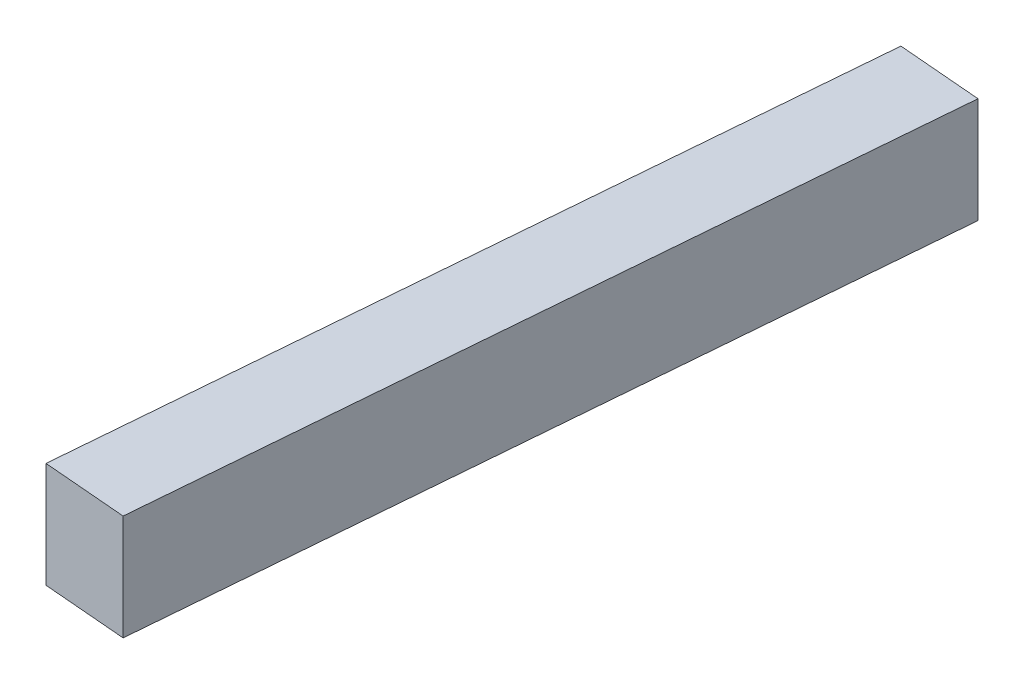
ISO-10303-21;
HEADER;
FILE_DESCRIPTION(('STEP AP214'),'2;1');
FILE_NAME('part.step','',(''),(''),'','','');
FILE_SCHEMA(('AUTOMOTIVE_DESIGN { 1 0 10303 214 1 1 1 1 }'));
ENDSEC;
DATA;
#1=APPLICATION_CONTEXT('core data for automotive mechanical design processes');
#2=APPLICATION_PROTOCOL_DEFINITION('international standard','automotive_design',2000,#1);
#3=PRODUCT_CONTEXT('',#1,'mechanical');
#4=PRODUCT('Part','Part','',(#3));
#5=PRODUCT_RELATED_PRODUCT_CATEGORY('part','',(#4));
#6=PRODUCT_DEFINITION_FORMATION('','',#4);
#7=PRODUCT_DEFINITION_CONTEXT('part definition',#1,'design');
#8=PRODUCT_DEFINITION('design','',#6,#7);
#9=PRODUCT_DEFINITION_SHAPE('','',#8);
#10=(LENGTH_UNIT() NAMED_UNIT(*) SI_UNIT(.MILLI.,.METRE.));
#11=(NAMED_UNIT(*) PLANE_ANGLE_UNIT() SI_UNIT($,.RADIAN.));
#12=(NAMED_UNIT(*) SI_UNIT($,.STERADIAN.) SOLID_ANGLE_UNIT());
#13=UNCERTAINTY_MEASURE_WITH_UNIT(LENGTH_MEASURE(1.E-05),#10,'distance_accuracy_value','');
#14=(GEOMETRIC_REPRESENTATION_CONTEXT(3) GLOBAL_UNCERTAINTY_ASSIGNED_CONTEXT((#13)) GLOBAL_UNIT_ASSIGNED_CONTEXT((#10,
#11,#12)) REPRESENTATION_CONTEXT('',''));
#15=CARTESIAN_POINT('',(0.,0.,0.));
#16=DIRECTION('',(0.,0.,1.));
#17=DIRECTION('',(1.,0.,0.));
#18=AXIS2_PLACEMENT_3D('',#15,#16,#17);
#19=CARTESIAN_POINT('',(1.40170801154344,7.874,-17.9427069925012));
#20=DIRECTION('',(0.996514246591171,0.,0.0834227567323899));
#21=DIRECTION('',(0.0834227567323899,0.,-0.996514246591171));
#22=AXIS2_PLACEMENT_3D('',#19,#20,#21);
#23=PLANE('',#22);
#24=DIRECTION('',(0.,1.,0.));
#25=VECTOR('',#24,1.);
#26=CARTESIAN_POINT('',(1.40170801154344,7.874,-17.9427069925012));
#27=LINE('',#26,#25);
#28=CARTESIAN_POINT('',(1.40170801154344,7.62,-17.9427069925012));
#29=VERTEX_POINT('',#28);
#30=CARTESIAN_POINT('',(1.40170801154344,7.874,-17.9427069925012));
#31=VERTEX_POINT('',#30);
#32=EDGE_CURVE('E20',#29,#31,#27,.T.);
#33=ORIENTED_EDGE('',*,*,#32,.T.);
#34=DIRECTION('',(0.0834227567323927,0.,-0.99651424659117));
#35=VECTOR('',#34,1.);
#36=CARTESIAN_POINT('',(1.40170801154344,7.874,-17.9427069925012));
#37=LINE('',#36,#35);
#38=CARTESIAN_POINT('',(1.56062836311865,7.874,-19.8410666322574));
#39=VERTEX_POINT('',#38);
#40=EDGE_CURVE('E55',#31,#39,#37,.T.);
#41=ORIENTED_EDGE('',*,*,#40,.T.);
#42=DIRECTION('',(0.,1.,0.));
#43=VECTOR('',#42,1.);
#44=CARTESIAN_POINT('',(1.56062836311865,7.874,-19.8410666322574));
#45=LINE('',#44,#43);
#46=CARTESIAN_POINT('',(1.56062836311865,7.62,-19.8410666322574));
#47=VERTEX_POINT('',#46);
#48=EDGE_CURVE('E76',#39,#47,#45,.F.);
#49=ORIENTED_EDGE('',*,*,#48,.T.);
#50=DIRECTION('',(0.0834227567323927,0.,-0.99651424659117));
#51=VECTOR('',#50,1.);
#52=CARTESIAN_POINT('',(1.40170801154344,7.62,-17.9427069925012));
#53=LINE('',#52,#51);
#54=EDGE_CURVE('E58',#29,#47,#53,.T.);
#55=ORIENTED_EDGE('',*,*,#54,.F.);
#56=EDGE_LOOP('',(#33,#41,#49,#55));
#57=FACE_BOUND('',#56,.T.);
#58=ADVANCED_FACE('F17',(#57),#23,.F.);
#59=CARTESIAN_POINT('',(1.40170801154344,7.874,-17.9427069925012));
#60=DIRECTION('',(0.0834227567323683,0.,-0.996514246591173));
#61=DIRECTION('',(-0.996514246591173,0.,-0.0834227567323683));
#62=AXIS2_PLACEMENT_3D('',#59,#60,#61);
#63=PLANE('',#62);
#64=DIRECTION('',(0.,1.,0.));
#65=VECTOR('',#64,1.);
#66=CARTESIAN_POINT('',(1.60419970645077,7.874,-17.9257554883332));
#67=LINE('',#66,#65);
#68=CARTESIAN_POINT('',(1.60419970645077,7.62,-17.9257554883332));
#69=VERTEX_POINT('',#68);
#70=CARTESIAN_POINT('',(1.60419970645077,7.874,-17.9257554883332));
#71=VERTEX_POINT('',#70);
#72=EDGE_CURVE('E73',#69,#71,#67,.T.);
#73=ORIENTED_EDGE('',*,*,#72,.T.);
#74=DIRECTION('',(-0.996514246591178,0.,-0.0834227567323003));
#75=VECTOR('',#74,1.);
#76=CARTESIAN_POINT('',(1.60419970645077,7.874,-17.9257554883332));
#77=LINE('',#76,#75);
#78=EDGE_CURVE('E63',#71,#31,#77,.T.);
#79=ORIENTED_EDGE('',*,*,#78,.T.);
#80=ORIENTED_EDGE('',*,*,#32,.F.);
#81=DIRECTION('',(-0.996514246591178,0.,-0.0834227567323003));
#82=VECTOR('',#81,1.);
#83=CARTESIAN_POINT('',(1.60419970645077,7.62,-17.9257554883332));
#84=LINE('',#83,#82);
#85=EDGE_CURVE('E80',#69,#29,#84,.T.);
#86=ORIENTED_EDGE('',*,*,#85,.F.);
#87=EDGE_LOOP('',(#73,#79,#80,#86));
#88=FACE_BOUND('',#87,.T.);
#89=ADVANCED_FACE('F72',(#88),#63,.F.);
#90=CARTESIAN_POINT('',(1.40170801154344,7.874,-17.9427069925012));
#91=DIRECTION('',(0.,-1.,0.));
#92=DIRECTION('',(0.,0.,-1.));
#93=AXIS2_PLACEMENT_3D('',#90,#91,#92);
#94=PLANE('',#93);
#95=ORIENTED_EDGE('',*,*,#78,.F.);
#96=DIRECTION('',(-0.0834227567323892,0.,0.996514246591171));
#97=VECTOR('',#96,1.);
#98=CARTESIAN_POINT('',(1.60419970645077,7.874,-17.9257554883332));
#99=LINE('',#98,#97);
#100=CARTESIAN_POINT('',(1.76312005805178,7.874,-19.8241151283977));
#101=VERTEX_POINT('',#100);
#102=EDGE_CURVE('E83',#71,#101,#99,.F.);
#103=ORIENTED_EDGE('',*,*,#102,.T.);
#104=DIRECTION('',(0.996514246718167,0.,0.0834227552153736));
#105=VECTOR('',#104,1.);
#106=CARTESIAN_POINT('',(1.56062836311865,7.874,-19.8410666322574));
#107=LINE('',#106,#105);
#108=EDGE_CURVE('E69',#101,#39,#107,.F.);
#109=ORIENTED_EDGE('',*,*,#108,.T.);
#110=ORIENTED_EDGE('',*,*,#40,.F.);
#111=EDGE_LOOP('',(#95,#103,#109,#110));
#112=FACE_BOUND('',#111,.T.);
#113=ADVANCED_FACE('F66',(#112),#94,.F.);
#114=CARTESIAN_POINT('',(1.56062836311865,7.874,-19.8410666322574));
#115=DIRECTION('',(-0.0834227552153736,0.,0.996514246718167));
#116=DIRECTION('',(0.996514246718167,0.,0.0834227552153736));
#117=AXIS2_PLACEMENT_3D('',#114,#115,#116);
#118=PLANE('',#117);
#119=ORIENTED_EDGE('',*,*,#48,.F.);
#120=ORIENTED_EDGE('',*,*,#108,.F.);
#121=DIRECTION('',(0.,1.,0.));
#122=VECTOR('',#121,1.);
#123=CARTESIAN_POINT('',(1.76312005805178,7.874,-19.8241151283977));
#124=LINE('',#123,#122);
#125=CARTESIAN_POINT('',(1.76312005805178,7.62,-19.8241151283977));
#126=VERTEX_POINT('',#125);
#127=EDGE_CURVE('E26',#101,#126,#124,.F.);
#128=ORIENTED_EDGE('',*,*,#127,.T.);
#129=DIRECTION('',(0.996514246718192,0.,0.0834227552150699));
#130=VECTOR('',#129,1.);
#131=CARTESIAN_POINT('',(1.56062836311865,7.62,-19.8410666322574));
#132=LINE('',#131,#130);
#133=EDGE_CURVE('E34',#47,#126,#132,.T.);
#134=ORIENTED_EDGE('',*,*,#133,.F.);
#135=EDGE_LOOP('',(#119,#120,#128,#134));
#136=FACE_BOUND('',#135,.T.);
#137=ADVANCED_FACE('F88',(#136),#118,.F.);
#138=CARTESIAN_POINT('',(1.40170801154344,7.62,-17.9427069925012));
#139=DIRECTION('',(0.,-1.,0.));
#140=DIRECTION('',(0.,0.,-1.));
#141=AXIS2_PLACEMENT_3D('',#138,#139,#140);
#142=PLANE('',#141);
#143=DIRECTION('',(-0.0834227567323892,0.,0.996514246591171));
#144=VECTOR('',#143,1.);
#145=CARTESIAN_POINT('',(1.60419970645077,7.62,-17.9257554883332));
#146=LINE('',#145,#144);
#147=EDGE_CURVE('E11',#126,#69,#146,.T.);
#148=ORIENTED_EDGE('',*,*,#147,.T.);
#149=ORIENTED_EDGE('',*,*,#85,.T.);
#150=ORIENTED_EDGE('',*,*,#54,.T.);
#151=ORIENTED_EDGE('',*,*,#133,.T.);
#152=EDGE_LOOP('',(#148,#149,#150,#151));
#153=FACE_BOUND('',#152,.T.);
#154=ADVANCED_FACE('F91',(#153),#142,.T.);
#155=CARTESIAN_POINT('',(1.60419970645077,7.874,-17.9257554883332));
#156=DIRECTION('',(-0.996514246591171,0.,-0.0834227567323892));
#157=DIRECTION('',(-0.0834227567323892,0.,0.996514246591171));
#158=AXIS2_PLACEMENT_3D('',#155,#156,#157);
#159=PLANE('',#158);
#160=ORIENTED_EDGE('',*,*,#127,.F.);
#161=ORIENTED_EDGE('',*,*,#102,.F.);
#162=ORIENTED_EDGE('',*,*,#72,.F.);
#163=ORIENTED_EDGE('',*,*,#147,.F.);
#164=EDGE_LOOP('',(#160,#161,#162,#163));
#165=FACE_BOUND('',#164,.T.);
#166=ADVANCED_FACE('F90',(#165),#159,.F.);
#167=CLOSED_SHELL('',(#58,#89,#113,#137,#154,#166));
#168=MANIFOLD_SOLID_BREP('B1',#167);
#169=ADVANCED_BREP_SHAPE_REPRESENTATION('',(#18,#168),#14);
#170=SHAPE_DEFINITION_REPRESENTATION(#9,#169);
ENDSEC;
END-ISO-10303-21;
